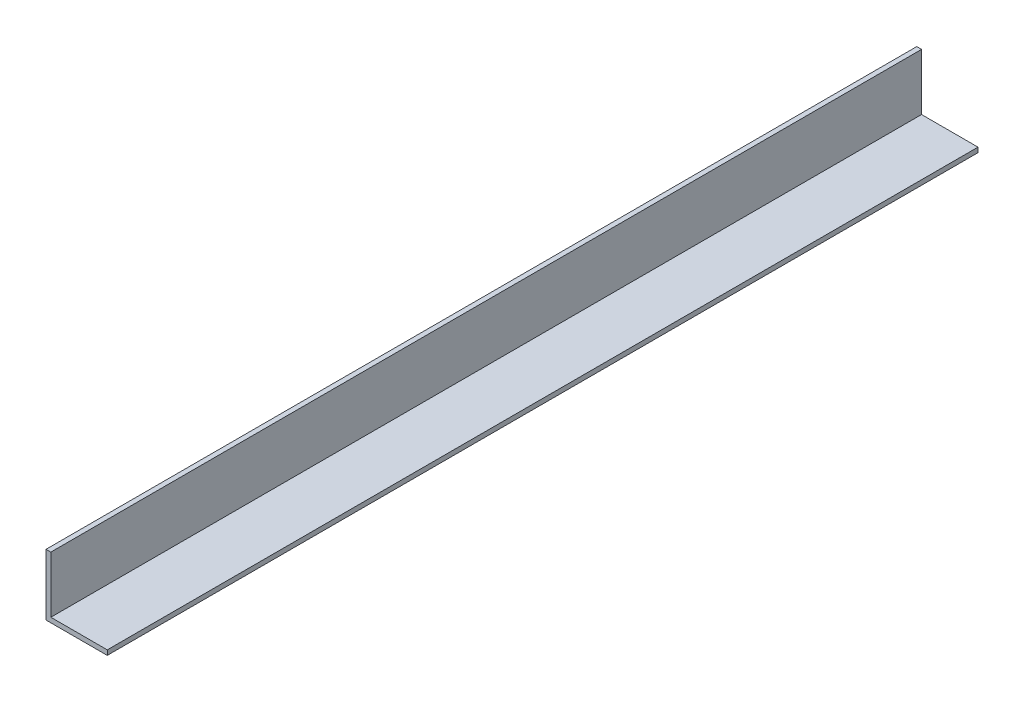
ISO-10303-21;
HEADER;
FILE_DESCRIPTION(('STEP AP214'),'2;1');
FILE_NAME('part.step','',(''),(''),'','','');
FILE_SCHEMA(('AUTOMOTIVE_DESIGN { 1 0 10303 214 1 1 1 1 }'));
ENDSEC;
DATA;
#1=APPLICATION_CONTEXT('core data for automotive mechanical design processes');
#2=APPLICATION_PROTOCOL_DEFINITION('international standard','automotive_design',2000,#1);
#3=PRODUCT_CONTEXT('',#1,'mechanical');
#4=PRODUCT('Part','Part','',(#3));
#5=PRODUCT_RELATED_PRODUCT_CATEGORY('part','',(#4));
#6=PRODUCT_DEFINITION_FORMATION('','',#4);
#7=PRODUCT_DEFINITION_CONTEXT('part definition',#1,'design');
#8=PRODUCT_DEFINITION('design','',#6,#7);
#9=PRODUCT_DEFINITION_SHAPE('','',#8);
#10=(LENGTH_UNIT() NAMED_UNIT(*) SI_UNIT(.MILLI.,.METRE.));
#11=(NAMED_UNIT(*) PLANE_ANGLE_UNIT() SI_UNIT($,.RADIAN.));
#12=(NAMED_UNIT(*) SI_UNIT($,.STERADIAN.) SOLID_ANGLE_UNIT());
#13=UNCERTAINTY_MEASURE_WITH_UNIT(LENGTH_MEASURE(1.E-05),#10,'distance_accuracy_value','');
#14=(GEOMETRIC_REPRESENTATION_CONTEXT(3) GLOBAL_UNCERTAINTY_ASSIGNED_CONTEXT((#13)) GLOBAL_UNIT_ASSIGNED_CONTEXT((#10,
#11,#12)) REPRESENTATION_CONTEXT('',''));
#15=CARTESIAN_POINT('',(0.,0.,0.));
#16=DIRECTION('',(0.,0.,1.));
#17=DIRECTION('',(1.,0.,0.));
#18=AXIS2_PLACEMENT_3D('',#15,#16,#17);
#19=CARTESIAN_POINT('',(25.4,0.,361.));
#20=DIRECTION('',(0.,1.,0.));
#21=DIRECTION('',(-1.,0.,0.));
#22=AXIS2_PLACEMENT_3D('',#19,#20,#21);
#23=PLANE('',#22);
#24=DIRECTION('',(1.,0.,0.));
#25=VECTOR('',#24,1.);
#26=CARTESIAN_POINT('',(25.4,0.,0.));
#27=LINE('',#26,#25);
#28=CARTESIAN_POINT('',(0.,0.,0.));
#29=VERTEX_POINT('',#28);
#30=CARTESIAN_POINT('',(25.4,0.,0.));
#31=VERTEX_POINT('',#30);
#32=EDGE_CURVE('E128',#29,#31,#27,.T.);
#33=ORIENTED_EDGE('',*,*,#32,.T.);
#34=DIRECTION('',(0.,0.,-1.));
#35=VECTOR('',#34,1.);
#36=CARTESIAN_POINT('',(25.4,0.,361.));
#37=LINE('',#36,#35);
#38=CARTESIAN_POINT('',(25.4,0.,361.));
#39=VERTEX_POINT('',#38);
#40=EDGE_CURVE('E11',#39,#31,#37,.T.);
#41=ORIENTED_EDGE('',*,*,#40,.F.);
#42=DIRECTION('',(1.,0.,0.));
#43=VECTOR('',#42,1.);
#44=CARTESIAN_POINT('',(25.4,0.,361.));
#45=LINE('',#44,#43);
#46=CARTESIAN_POINT('',(0.,0.,361.));
#47=VERTEX_POINT('',#46);
#48=EDGE_CURVE('E144',#47,#39,#45,.T.);
#49=ORIENTED_EDGE('',*,*,#48,.F.);
#50=DIRECTION('',(0.,0.,-1.));
#51=VECTOR('',#50,1.);
#52=CARTESIAN_POINT('',(0.,0.,361.));
#53=LINE('',#52,#51);
#54=EDGE_CURVE('E124',#47,#29,#53,.T.);
#55=ORIENTED_EDGE('',*,*,#54,.T.);
#56=EDGE_LOOP('',(#33,#41,#49,#55));
#57=FACE_BOUND('',#56,.T.);
#58=ADVANCED_FACE('F39',(#57),#23,.F.);
#59=CARTESIAN_POINT('',(25.4,2.,361.));
#60=DIRECTION('',(-1.,0.,0.));
#61=DIRECTION('',(0.,0.,1.));
#62=AXIS2_PLACEMENT_3D('',#59,#60,#61);
#63=PLANE('',#62);
#64=DIRECTION('',(0.,1.,0.));
#65=VECTOR('',#64,1.);
#66=CARTESIAN_POINT('',(25.4,2.,0.));
#67=LINE('',#66,#65);
#68=CARTESIAN_POINT('',(25.4,2.,0.));
#69=VERTEX_POINT('',#68);
#70=EDGE_CURVE('E132',#31,#69,#67,.T.);
#71=ORIENTED_EDGE('',*,*,#70,.T.);
#72=DIRECTION('',(0.,0.,-1.));
#73=VECTOR('',#72,1.);
#74=CARTESIAN_POINT('',(25.4,2.,361.));
#75=LINE('',#74,#73);
#76=CARTESIAN_POINT('',(25.4,2.,361.));
#77=VERTEX_POINT('',#76);
#78=EDGE_CURVE('E48',#77,#69,#75,.T.);
#79=ORIENTED_EDGE('',*,*,#78,.F.);
#80=DIRECTION('',(0.,1.,0.));
#81=VECTOR('',#80,1.);
#82=CARTESIAN_POINT('',(25.4,2.,361.));
#83=LINE('',#82,#81);
#84=EDGE_CURVE('E93',#39,#77,#83,.T.);
#85=ORIENTED_EDGE('',*,*,#84,.F.);
#86=ORIENTED_EDGE('',*,*,#40,.T.);
#87=EDGE_LOOP('',(#71,#79,#85,#86));
#88=FACE_BOUND('',#87,.T.);
#89=ADVANCED_FACE('F172',(#88),#63,.F.);
#90=CARTESIAN_POINT('',(2.,2.,361.));
#91=DIRECTION('',(0.,-1.,0.));
#92=DIRECTION('',(1.,0.,0.));
#93=AXIS2_PLACEMENT_3D('',#90,#91,#92);
#94=PLANE('',#93);
#95=DIRECTION('',(-1.,0.,0.));
#96=VECTOR('',#95,1.);
#97=CARTESIAN_POINT('',(2.,2.,0.));
#98=LINE('',#97,#96);
#99=CARTESIAN_POINT('',(2.,2.,0.));
#100=VERTEX_POINT('',#99);
#101=EDGE_CURVE('E135',#69,#100,#98,.T.);
#102=ORIENTED_EDGE('',*,*,#101,.T.);
#103=DIRECTION('',(0.,0.,-1.));
#104=VECTOR('',#103,1.);
#105=CARTESIAN_POINT('',(2.,2.,361.));
#106=LINE('',#105,#104);
#107=CARTESIAN_POINT('',(2.,2.,361.));
#108=VERTEX_POINT('',#107);
#109=EDGE_CURVE('E117',#108,#100,#106,.T.);
#110=ORIENTED_EDGE('',*,*,#109,.F.);
#111=DIRECTION('',(-1.,0.,0.));
#112=VECTOR('',#111,1.);
#113=CARTESIAN_POINT('',(2.,2.,361.));
#114=LINE('',#113,#112);
#115=EDGE_CURVE('E106',#77,#108,#114,.T.);
#116=ORIENTED_EDGE('',*,*,#115,.F.);
#117=ORIENTED_EDGE('',*,*,#78,.T.);
#118=EDGE_LOOP('',(#102,#110,#116,#117));
#119=FACE_BOUND('',#118,.T.);
#120=ADVANCED_FACE('F154',(#119),#94,.F.);
#121=CARTESIAN_POINT('',(2.,25.4,361.));
#122=DIRECTION('',(-1.,0.,0.));
#123=DIRECTION('',(0.,-1.,0.));
#124=AXIS2_PLACEMENT_3D('',#121,#122,#123);
#125=PLANE('',#124);
#126=DIRECTION('',(0.,1.,0.));
#127=VECTOR('',#126,1.);
#128=CARTESIAN_POINT('',(2.,25.4,0.));
#129=LINE('',#128,#127);
#130=CARTESIAN_POINT('',(2.,25.4,0.));
#131=VERTEX_POINT('',#130);
#132=EDGE_CURVE('E115',#100,#131,#129,.T.);
#133=ORIENTED_EDGE('',*,*,#132,.T.);
#134=DIRECTION('',(0.,0.,-1.));
#135=VECTOR('',#134,1.);
#136=CARTESIAN_POINT('',(2.,25.4,361.));
#137=LINE('',#136,#135);
#138=CARTESIAN_POINT('',(2.,25.4,361.));
#139=VERTEX_POINT('',#138);
#140=EDGE_CURVE('E112',#139,#131,#137,.T.);
#141=ORIENTED_EDGE('',*,*,#140,.F.);
#142=DIRECTION('',(0.,1.,0.));
#143=VECTOR('',#142,1.);
#144=CARTESIAN_POINT('',(2.,25.4,361.));
#145=LINE('',#144,#143);
#146=EDGE_CURVE('E100',#108,#139,#145,.T.);
#147=ORIENTED_EDGE('',*,*,#146,.F.);
#148=ORIENTED_EDGE('',*,*,#109,.T.);
#149=EDGE_LOOP('',(#133,#141,#147,#148));
#150=FACE_BOUND('',#149,.T.);
#151=ADVANCED_FACE('F113',(#150),#125,.F.);
#152=CARTESIAN_POINT('',(0.,25.4,361.));
#153=DIRECTION('',(0.,-1.,0.));
#154=DIRECTION('',(0.,0.,-1.));
#155=AXIS2_PLACEMENT_3D('',#152,#153,#154);
#156=PLANE('',#155);
#157=DIRECTION('',(-1.,0.,0.));
#158=VECTOR('',#157,1.);
#159=CARTESIAN_POINT('',(0.,25.4,0.));
#160=LINE('',#159,#158);
#161=CARTESIAN_POINT('',(0.,25.4,0.));
#162=VERTEX_POINT('',#161);
#163=EDGE_CURVE('E79',#131,#162,#160,.T.);
#164=ORIENTED_EDGE('',*,*,#163,.T.);
#165=DIRECTION('',(0.,0.,-1.));
#166=VECTOR('',#165,1.);
#167=CARTESIAN_POINT('',(0.,25.4,361.));
#168=LINE('',#167,#166);
#169=CARTESIAN_POINT('',(0.,25.4,361.));
#170=VERTEX_POINT('',#169);
#171=EDGE_CURVE('E118',#170,#162,#168,.T.);
#172=ORIENTED_EDGE('',*,*,#171,.F.);
#173=DIRECTION('',(-1.,0.,0.));
#174=VECTOR('',#173,1.);
#175=CARTESIAN_POINT('',(0.,25.4,361.));
#176=LINE('',#175,#174);
#177=EDGE_CURVE('E104',#139,#170,#176,.T.);
#178=ORIENTED_EDGE('',*,*,#177,.F.);
#179=ORIENTED_EDGE('',*,*,#140,.T.);
#180=EDGE_LOOP('',(#164,#172,#178,#179));
#181=FACE_BOUND('',#180,.T.);
#182=ADVANCED_FACE('F120',(#181),#156,.F.);
#183=CARTESIAN_POINT('',(0.,0.,361.));
#184=DIRECTION('',(1.,0.,0.));
#185=DIRECTION('',(0.,0.,-1.));
#186=AXIS2_PLACEMENT_3D('',#183,#184,#185);
#187=PLANE('',#186);
#188=DIRECTION('',(0.,-1.,0.));
#189=VECTOR('',#188,1.);
#190=CARTESIAN_POINT('',(0.,0.,0.));
#191=LINE('',#190,#189);
#192=EDGE_CURVE('E85',#162,#29,#191,.T.);
#193=ORIENTED_EDGE('',*,*,#192,.T.);
#194=ORIENTED_EDGE('',*,*,#54,.F.);
#195=DIRECTION('',(0.,-1.,0.));
#196=VECTOR('',#195,1.);
#197=CARTESIAN_POINT('',(0.,0.,361.));
#198=LINE('',#197,#196);
#199=EDGE_CURVE('E56',#170,#47,#198,.T.);
#200=ORIENTED_EDGE('',*,*,#199,.F.);
#201=ORIENTED_EDGE('',*,*,#171,.T.);
#202=EDGE_LOOP('',(#193,#194,#200,#201));
#203=FACE_BOUND('',#202,.T.);
#204=ADVANCED_FACE('F161',(#203),#187,.F.);
#205=CARTESIAN_POINT('',(0.,0.,361.));
#206=DIRECTION('',(0.,0.,-1.));
#207=DIRECTION('',(-1.,0.,0.));
#208=AXIS2_PLACEMENT_3D('',#205,#206,#207);
#209=PLANE('',#208);
#210=ORIENTED_EDGE('',*,*,#48,.T.);
#211=ORIENTED_EDGE('',*,*,#84,.T.);
#212=ORIENTED_EDGE('',*,*,#115,.T.);
#213=ORIENTED_EDGE('',*,*,#146,.T.);
#214=ORIENTED_EDGE('',*,*,#177,.T.);
#215=ORIENTED_EDGE('',*,*,#199,.T.);
#216=EDGE_LOOP('',(#210,#211,#212,#213,#214,#215));
#217=FACE_BOUND('',#216,.T.);
#218=ADVANCED_FACE('F102',(#217),#209,.F.);
#219=CARTESIAN_POINT('',(0.,0.,0.));
#220=DIRECTION('',(0.,0.,-1.));
#221=DIRECTION('',(-1.,0.,0.));
#222=AXIS2_PLACEMENT_3D('',#219,#220,#221);
#223=PLANE('',#222);
#224=ORIENTED_EDGE('',*,*,#32,.F.);
#225=ORIENTED_EDGE('',*,*,#192,.F.);
#226=ORIENTED_EDGE('',*,*,#163,.F.);
#227=ORIENTED_EDGE('',*,*,#132,.F.);
#228=ORIENTED_EDGE('',*,*,#101,.F.);
#229=ORIENTED_EDGE('',*,*,#70,.F.);
#230=EDGE_LOOP('',(#224,#225,#226,#227,#228,#229));
#231=FACE_BOUND('',#230,.T.);
#232=ADVANCED_FACE('F157',(#231),#223,.T.);
#233=CLOSED_SHELL('',(#58,#89,#120,#151,#182,#204,#218,#232));
#234=MANIFOLD_SOLID_BREP('B2',#233);
#235=ADVANCED_BREP_SHAPE_REPRESENTATION('',(#18,#234),#14);
#236=SHAPE_DEFINITION_REPRESENTATION(#9,#235);
ENDSEC;
END-ISO-10303-21;
